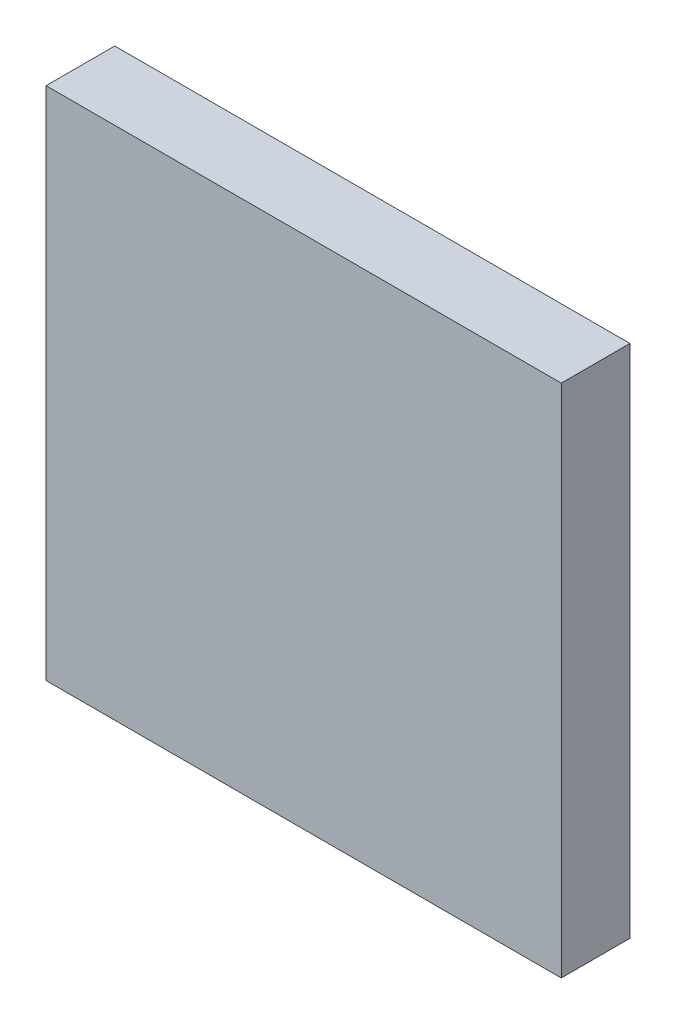
ISO-10303-21;
HEADER;
FILE_DESCRIPTION(('STEP AP214'),'2;1');
FILE_NAME('part.step','',(''),(''),'','','');
FILE_SCHEMA(('AUTOMOTIVE_DESIGN { 1 0 10303 214 1 1 1 1 }'));
ENDSEC;
DATA;
#1=APPLICATION_CONTEXT('core data for automotive mechanical design processes');
#2=APPLICATION_PROTOCOL_DEFINITION('international standard','automotive_design',2000,#1);
#3=PRODUCT_CONTEXT('',#1,'mechanical');
#4=PRODUCT('Part','Part','',(#3));
#5=PRODUCT_RELATED_PRODUCT_CATEGORY('part','',(#4));
#6=PRODUCT_DEFINITION_FORMATION('','',#4);
#7=PRODUCT_DEFINITION_CONTEXT('part definition',#1,'design');
#8=PRODUCT_DEFINITION('design','',#6,#7);
#9=PRODUCT_DEFINITION_SHAPE('','',#8);
#10=(LENGTH_UNIT() NAMED_UNIT(*) SI_UNIT(.MILLI.,.METRE.));
#11=(NAMED_UNIT(*) PLANE_ANGLE_UNIT() SI_UNIT($,.RADIAN.));
#12=(NAMED_UNIT(*) SI_UNIT($,.STERADIAN.) SOLID_ANGLE_UNIT());
#13=UNCERTAINTY_MEASURE_WITH_UNIT(LENGTH_MEASURE(1.E-05),#10,'distance_accuracy_value','');
#14=(GEOMETRIC_REPRESENTATION_CONTEXT(3) GLOBAL_UNCERTAINTY_ASSIGNED_CONTEXT((#13)) GLOBAL_UNIT_ASSIGNED_CONTEXT((#10,
#11,#12)) REPRESENTATION_CONTEXT('',''));
#15=CARTESIAN_POINT('',(0.,0.,0.));
#16=DIRECTION('',(0.,0.,1.));
#17=DIRECTION('',(1.,0.,0.));
#18=AXIS2_PLACEMENT_3D('',#15,#16,#17);
#19=CARTESIAN_POINT('',(0.,0.,0.));
#20=DIRECTION('',(0.,0.,-1.));
#21=DIRECTION('',(-1.,0.,0.));
#22=AXIS2_PLACEMENT_3D('',#19,#20,#21);
#23=PLANE('',#22);
#24=DIRECTION('',(0.,1.,0.));
#25=VECTOR('',#24,1.);
#26=CARTESIAN_POINT('',(-50.6435480085704,21.5461850902088,0.));
#27=LINE('',#26,#25);
#28=CARTESIAN_POINT('',(-50.6435480085704,21.5461850902088,0.));
#29=VERTEX_POINT('',#28);
#30=CARTESIAN_POINT('',(-50.6435480085704,51.5461850902088,0.));
#31=VERTEX_POINT('',#30);
#32=EDGE_CURVE('E128',#29,#31,#27,.T.);
#33=ORIENTED_EDGE('',*,*,#32,.F.);
#34=DIRECTION('',(1.,0.,0.));
#35=VECTOR('',#34,1.);
#36=CARTESIAN_POINT('',(-80.6435480085703,21.5461850902088,0.));
#37=LINE('',#36,#35);
#38=CARTESIAN_POINT('',(-80.6435480085703,21.5461850902088,0.));
#39=VERTEX_POINT('',#38);
#40=EDGE_CURVE('E141',#39,#29,#37,.T.);
#41=ORIENTED_EDGE('',*,*,#40,.F.);
#42=DIRECTION('',(0.,-1.,0.));
#43=VECTOR('',#42,1.);
#44=CARTESIAN_POINT('',(-80.6435480085703,21.5461850902088,0.));
#45=LINE('',#44,#43);
#46=CARTESIAN_POINT('',(-80.6435480085703,51.5461850902088,0.));
#47=VERTEX_POINT('',#46);
#48=EDGE_CURVE('E149',#47,#39,#45,.T.);
#49=ORIENTED_EDGE('',*,*,#48,.F.);
#50=DIRECTION('',(-1.,0.,0.));
#51=VECTOR('',#50,1.);
#52=CARTESIAN_POINT('',(-80.6435480085703,51.5461850902088,0.));
#53=LINE('',#52,#51);
#54=EDGE_CURVE('E131',#31,#47,#53,.T.);
#55=ORIENTED_EDGE('',*,*,#54,.F.);
#56=EDGE_LOOP('',(#33,#41,#49,#55));
#57=FACE_BOUND('',#56,.T.);
#58=DIRECTION('',(0.,1.,0.));
#59=VECTOR('',#58,1.);
#60=CARTESIAN_POINT('',(-75.6435480085703,0.,0.));
#61=LINE('',#60,#59);
#62=CARTESIAN_POINT('',(-75.6435480085703,35.5461850902088,0.));
#63=VERTEX_POINT('',#62);
#64=CARTESIAN_POINT('',(-75.6435480085703,37.5461850902088,0.));
#65=VERTEX_POINT('',#64);
#66=EDGE_CURVE('E56',#63,#65,#61,.T.);
#67=ORIENTED_EDGE('',*,*,#66,.F.);
#68=DIRECTION('',(-1.,0.,0.));
#69=VECTOR('',#68,1.);
#70=CARTESIAN_POINT('',(0.,35.5461850902088,0.));
#71=LINE('',#70,#69);
#72=CARTESIAN_POINT('',(-55.6435480085703,35.5461850902088,0.));
#73=VERTEX_POINT('',#72);
#74=EDGE_CURVE('E127',#73,#63,#71,.T.);
#75=ORIENTED_EDGE('',*,*,#74,.F.);
#76=DIRECTION('',(0.,1.,0.));
#77=VECTOR('',#76,1.);
#78=CARTESIAN_POINT('',(-55.6435480085703,0.,0.));
#79=LINE('',#78,#77);
#80=CARTESIAN_POINT('',(-55.6435480085703,37.5461850902088,0.));
#81=VERTEX_POINT('',#80);
#82=EDGE_CURVE('E124',#73,#81,#79,.T.);
#83=ORIENTED_EDGE('',*,*,#82,.T.);
#84=DIRECTION('',(-1.,0.,0.));
#85=VECTOR('',#84,1.);
#86=CARTESIAN_POINT('',(0.,37.5461850902088,0.));
#87=LINE('',#86,#85);
#88=EDGE_CURVE('E61',#81,#65,#87,.T.);
#89=ORIENTED_EDGE('',*,*,#88,.T.);
#90=EDGE_LOOP('',(#67,#75,#83,#89));
#91=FACE_BOUND('',#90,.T.);
#92=ADVANCED_FACE('F41',(#57,#91),#23,.T.);
#93=CARTESIAN_POINT('',(-50.6435480085704,21.5461850902088,4.));
#94=DIRECTION('',(-1.,0.,0.));
#95=DIRECTION('',(0.,0.,1.));
#96=AXIS2_PLACEMENT_3D('',#93,#94,#95);
#97=PLANE('',#96);
#98=ORIENTED_EDGE('',*,*,#32,.T.);
#99=DIRECTION('',(0.,0.,-1.));
#100=VECTOR('',#99,1.);
#101=CARTESIAN_POINT('',(-50.6435480085704,51.5461850902088,4.));
#102=LINE('',#101,#100);
#103=CARTESIAN_POINT('',(-50.6435480085704,51.5461850902088,4.));
#104=VERTEX_POINT('',#103);
#105=EDGE_CURVE('E11',#104,#31,#102,.T.);
#106=ORIENTED_EDGE('',*,*,#105,.F.);
#107=DIRECTION('',(0.,1.,0.));
#108=VECTOR('',#107,1.);
#109=CARTESIAN_POINT('',(-50.6435480085704,21.5461850902088,4.));
#110=LINE('',#109,#108);
#111=CARTESIAN_POINT('',(-50.6435480085704,21.5461850902088,4.));
#112=VERTEX_POINT('',#111);
#113=EDGE_CURVE('E137',#112,#104,#110,.T.);
#114=ORIENTED_EDGE('',*,*,#113,.F.);
#115=DIRECTION('',(0.,0.,-1.));
#116=VECTOR('',#115,1.);
#117=CARTESIAN_POINT('',(-50.6435480085704,21.5461850902088,4.));
#118=LINE('',#117,#116);
#119=EDGE_CURVE('E146',#112,#29,#118,.T.);
#120=ORIENTED_EDGE('',*,*,#119,.T.);
#121=EDGE_LOOP('',(#98,#106,#114,#120));
#122=FACE_BOUND('',#121,.T.);
#123=ADVANCED_FACE('F43',(#122),#97,.F.);
#124=CARTESIAN_POINT('',(-80.6435480085703,51.5461850902088,4.));
#125=DIRECTION('',(0.,-1.,0.));
#126=DIRECTION('',(0.,0.,-1.));
#127=AXIS2_PLACEMENT_3D('',#124,#125,#126);
#128=PLANE('',#127);
#129=ORIENTED_EDGE('',*,*,#54,.T.);
#130=DIRECTION('',(0.,0.,-1.));
#131=VECTOR('',#130,1.);
#132=CARTESIAN_POINT('',(-80.6435480085703,51.5461850902088,4.));
#133=LINE('',#132,#131);
#134=CARTESIAN_POINT('',(-80.6435480085703,51.5461850902088,4.));
#135=VERTEX_POINT('',#134);
#136=EDGE_CURVE('E49',#135,#47,#133,.T.);
#137=ORIENTED_EDGE('',*,*,#136,.F.);
#138=DIRECTION('',(-1.,0.,0.));
#139=VECTOR('',#138,1.);
#140=CARTESIAN_POINT('',(-80.6435480085703,51.5461850902088,4.));
#141=LINE('',#140,#139);
#142=EDGE_CURVE('E140',#104,#135,#141,.T.);
#143=ORIENTED_EDGE('',*,*,#142,.F.);
#144=ORIENTED_EDGE('',*,*,#105,.T.);
#145=EDGE_LOOP('',(#129,#137,#143,#144));
#146=FACE_BOUND('',#145,.T.);
#147=ADVANCED_FACE('F176',(#146),#128,.F.);
#148=CARTESIAN_POINT('',(-80.6435480085703,21.5461850902088,4.));
#149=DIRECTION('',(1.,0.,0.));
#150=DIRECTION('',(0.,0.,-1.));
#151=AXIS2_PLACEMENT_3D('',#148,#149,#150);
#152=PLANE('',#151);
#153=ORIENTED_EDGE('',*,*,#48,.T.);
#154=DIRECTION('',(0.,0.,-1.));
#155=VECTOR('',#154,1.);
#156=CARTESIAN_POINT('',(-80.6435480085703,21.5461850902088,4.));
#157=LINE('',#156,#155);
#158=CARTESIAN_POINT('',(-80.6435480085703,21.5461850902088,4.));
#159=VERTEX_POINT('',#158);
#160=EDGE_CURVE('E154',#159,#39,#157,.T.);
#161=ORIENTED_EDGE('',*,*,#160,.F.);
#162=DIRECTION('',(0.,-1.,0.));
#163=VECTOR('',#162,1.);
#164=CARTESIAN_POINT('',(-80.6435480085703,21.5461850902088,4.));
#165=LINE('',#164,#163);
#166=EDGE_CURVE('E143',#135,#159,#165,.T.);
#167=ORIENTED_EDGE('',*,*,#166,.F.);
#168=ORIENTED_EDGE('',*,*,#136,.T.);
#169=EDGE_LOOP('',(#153,#161,#167,#168));
#170=FACE_BOUND('',#169,.T.);
#171=ADVANCED_FACE('F161',(#170),#152,.F.);
#172=CARTESIAN_POINT('',(-80.6435480085703,21.5461850902088,4.));
#173=DIRECTION('',(0.,1.,0.));
#174=DIRECTION('',(0.,0.,1.));
#175=AXIS2_PLACEMENT_3D('',#172,#173,#174);
#176=PLANE('',#175);
#177=ORIENTED_EDGE('',*,*,#40,.T.);
#178=ORIENTED_EDGE('',*,*,#119,.F.);
#179=DIRECTION('',(1.,0.,0.));
#180=VECTOR('',#179,1.);
#181=CARTESIAN_POINT('',(-80.6435480085703,21.5461850902088,4.));
#182=LINE('',#181,#180);
#183=EDGE_CURVE('E145',#159,#112,#182,.T.);
#184=ORIENTED_EDGE('',*,*,#183,.F.);
#185=ORIENTED_EDGE('',*,*,#160,.T.);
#186=EDGE_LOOP('',(#177,#178,#184,#185));
#187=FACE_BOUND('',#186,.T.);
#188=ADVANCED_FACE('F169',(#187),#176,.F.);
#189=CARTESIAN_POINT('',(0.,0.,4.));
#190=DIRECTION('',(0.,0.,-1.));
#191=DIRECTION('',(-1.,0.,0.));
#192=AXIS2_PLACEMENT_3D('',#189,#190,#191);
#193=PLANE('',#192);
#194=ORIENTED_EDGE('',*,*,#113,.T.);
#195=ORIENTED_EDGE('',*,*,#142,.T.);
#196=ORIENTED_EDGE('',*,*,#166,.T.);
#197=ORIENTED_EDGE('',*,*,#183,.T.);
#198=EDGE_LOOP('',(#194,#195,#196,#197));
#199=FACE_BOUND('',#198,.T.);
#200=ADVANCED_FACE('F175',(#199),#193,.F.);
#201=CARTESIAN_POINT('',(0.,35.5461850902088,-2.));
#202=DIRECTION('',(0.,1.,0.));
#203=DIRECTION('',(-1.,0.,0.));
#204=AXIS2_PLACEMENT_3D('',#201,#202,#203);
#205=PLANE('',#204);
#206=ORIENTED_EDGE('',*,*,#74,.T.);
#207=DIRECTION('',(0.,0.,1.));
#208=VECTOR('',#207,1.);
#209=CARTESIAN_POINT('',(-75.6435480085703,35.5461850902088,-2.));
#210=LINE('',#209,#208);
#211=CARTESIAN_POINT('',(-75.6435480085703,35.5461850902088,-2.));
#212=VERTEX_POINT('',#211);
#213=EDGE_CURVE('E108',#212,#63,#210,.T.);
#214=ORIENTED_EDGE('',*,*,#213,.F.);
#215=DIRECTION('',(-1.,0.,0.));
#216=VECTOR('',#215,1.);
#217=CARTESIAN_POINT('',(0.,35.5461850902088,-2.));
#218=LINE('',#217,#216);
#219=CARTESIAN_POINT('',(-55.6435480085703,35.5461850902088,-2.));
#220=VERTEX_POINT('',#219);
#221=EDGE_CURVE('E115',#220,#212,#218,.T.);
#222=ORIENTED_EDGE('',*,*,#221,.F.);
#223=DIRECTION('',(0.,0.,1.));
#224=VECTOR('',#223,1.);
#225=CARTESIAN_POINT('',(-55.6435480085703,35.5461850902088,-2.));
#226=LINE('',#225,#224);
#227=EDGE_CURVE('E272',#220,#73,#226,.T.);
#228=ORIENTED_EDGE('',*,*,#227,.T.);
#229=EDGE_LOOP('',(#206,#214,#222,#228));
#230=FACE_BOUND('',#229,.T.);
#231=ADVANCED_FACE('F126',(#230),#205,.F.);
#232=CARTESIAN_POINT('',(-75.6435480085703,0.,-2.));
#233=DIRECTION('',(1.,0.,0.));
#234=DIRECTION('',(0.,0.,-1.));
#235=AXIS2_PLACEMENT_3D('',#232,#233,#234);
#236=PLANE('',#235);
#237=ORIENTED_EDGE('',*,*,#66,.T.);
#238=DIRECTION('',(0.,0.,1.));
#239=VECTOR('',#238,1.);
#240=CARTESIAN_POINT('',(-75.6435480085703,37.5461850902088,-2.));
#241=LINE('',#240,#239);
#242=CARTESIAN_POINT('',(-75.6435480085703,37.5461850902088,-2.));
#243=VERTEX_POINT('',#242);
#244=EDGE_CURVE('E110',#243,#65,#241,.T.);
#245=ORIENTED_EDGE('',*,*,#244,.F.);
#246=DIRECTION('',(0.,1.,0.));
#247=VECTOR('',#246,1.);
#248=CARTESIAN_POINT('',(-75.6435480085703,0.,-2.));
#249=LINE('',#248,#247);
#250=EDGE_CURVE('E104',#212,#243,#249,.T.);
#251=ORIENTED_EDGE('',*,*,#250,.F.);
#252=ORIENTED_EDGE('',*,*,#213,.T.);
#253=EDGE_LOOP('',(#237,#245,#251,#252));
#254=FACE_BOUND('',#253,.T.);
#255=ADVANCED_FACE('F106',(#254),#236,.F.);
#256=CARTESIAN_POINT('',(0.,37.5461850902088,-2.));
#257=DIRECTION('',(0.,1.,0.));
#258=DIRECTION('',(0.,0.,1.));
#259=AXIS2_PLACEMENT_3D('',#256,#257,#258);
#260=PLANE('',#259);
#261=ORIENTED_EDGE('',*,*,#88,.F.);
#262=DIRECTION('',(0.,0.,1.));
#263=VECTOR('',#262,1.);
#264=CARTESIAN_POINT('',(-55.6435480085703,37.5461850902088,-2.));
#265=LINE('',#264,#263);
#266=CARTESIAN_POINT('',(-55.6435480085703,37.5461850902088,-2.));
#267=VERTEX_POINT('',#266);
#268=EDGE_CURVE('E133',#267,#81,#265,.T.);
#269=ORIENTED_EDGE('',*,*,#268,.F.);
#270=DIRECTION('',(-1.,0.,0.));
#271=VECTOR('',#270,1.);
#272=CARTESIAN_POINT('',(0.,37.5461850902088,-2.));
#273=LINE('',#272,#271);
#274=EDGE_CURVE('E114',#267,#243,#273,.T.);
#275=ORIENTED_EDGE('',*,*,#274,.T.);
#276=ORIENTED_EDGE('',*,*,#244,.T.);
#277=EDGE_LOOP('',(#261,#269,#275,#276));
#278=FACE_BOUND('',#277,.T.);
#279=ADVANCED_FACE('F200',(#278),#260,.T.);
#280=CARTESIAN_POINT('',(-55.6435480085703,0.,-2.));
#281=DIRECTION('',(1.,0.,0.));
#282=DIRECTION('',(0.,0.,-1.));
#283=AXIS2_PLACEMENT_3D('',#280,#281,#282);
#284=PLANE('',#283);
#285=ORIENTED_EDGE('',*,*,#82,.F.);
#286=ORIENTED_EDGE('',*,*,#227,.F.);
#287=DIRECTION('',(0.,1.,0.));
#288=VECTOR('',#287,1.);
#289=CARTESIAN_POINT('',(-55.6435480085703,0.,-2.));
#290=LINE('',#289,#288);
#291=EDGE_CURVE('E121',#220,#267,#290,.T.);
#292=ORIENTED_EDGE('',*,*,#291,.T.);
#293=ORIENTED_EDGE('',*,*,#268,.T.);
#294=EDGE_LOOP('',(#285,#286,#292,#293));
#295=FACE_BOUND('',#294,.T.);
#296=ADVANCED_FACE('F205',(#295),#284,.T.);
#297=CARTESIAN_POINT('',(0.,0.,-2.));
#298=DIRECTION('',(0.,0.,-1.));
#299=DIRECTION('',(-1.,0.,0.));
#300=AXIS2_PLACEMENT_3D('',#297,#298,#299);
#301=PLANE('',#300);
#302=ORIENTED_EDGE('',*,*,#221,.T.);
#303=ORIENTED_EDGE('',*,*,#250,.T.);
#304=ORIENTED_EDGE('',*,*,#274,.F.);
#305=ORIENTED_EDGE('',*,*,#291,.F.);
#306=EDGE_LOOP('',(#302,#303,#304,#305));
#307=FACE_BOUND('',#306,.T.);
#308=ADVANCED_FACE('F119',(#307),#301,.T.);
#309=CLOSED_SHELL('',(#92,#123,#147,#171,#188,#200,#231,#255,#279,#296,#308));
#310=MANIFOLD_SOLID_BREP('B2',#309);
#311=ADVANCED_BREP_SHAPE_REPRESENTATION('',(#18,#310),#14);
#312=SHAPE_DEFINITION_REPRESENTATION(#9,#311);
ENDSEC;
END-ISO-10303-21;
